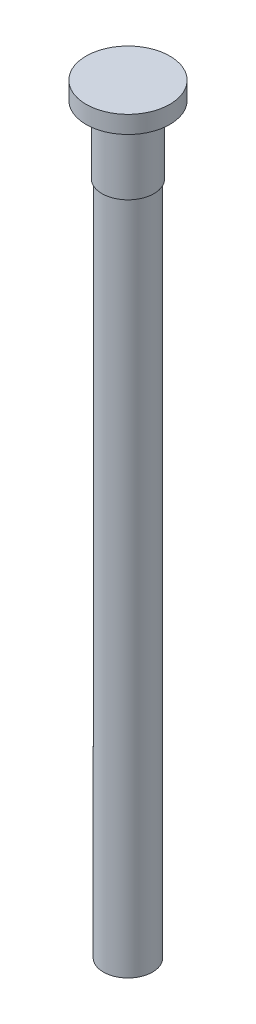
ISO-10303-21;
HEADER;
FILE_DESCRIPTION(('STEP AP214'),'2;1');
FILE_NAME('part.step','',(''),(''),'','','');
FILE_SCHEMA(('AUTOMOTIVE_DESIGN { 1 0 10303 214 1 1 1 1 }'));
ENDSEC;
DATA;
#1=APPLICATION_CONTEXT('core data for automotive mechanical design processes');
#2=APPLICATION_PROTOCOL_DEFINITION('international standard','automotive_design',2000,#1);
#3=PRODUCT_CONTEXT('',#1,'mechanical');
#4=PRODUCT('Part','Part','',(#3));
#5=PRODUCT_RELATED_PRODUCT_CATEGORY('part','',(#4));
#6=PRODUCT_DEFINITION_FORMATION('','',#4);
#7=PRODUCT_DEFINITION_CONTEXT('part definition',#1,'design');
#8=PRODUCT_DEFINITION('design','',#6,#7);
#9=PRODUCT_DEFINITION_SHAPE('','',#8);
#10=(LENGTH_UNIT() NAMED_UNIT(*) SI_UNIT(.MILLI.,.METRE.));
#11=(NAMED_UNIT(*) PLANE_ANGLE_UNIT() SI_UNIT($,.RADIAN.));
#12=(NAMED_UNIT(*) SI_UNIT($,.STERADIAN.) SOLID_ANGLE_UNIT());
#13=UNCERTAINTY_MEASURE_WITH_UNIT(LENGTH_MEASURE(1.E-05),#10,'distance_accuracy_value','');
#14=(GEOMETRIC_REPRESENTATION_CONTEXT(3) GLOBAL_UNCERTAINTY_ASSIGNED_CONTEXT((#13)) GLOBAL_UNIT_ASSIGNED_CONTEXT((#10,
#11,#12)) REPRESENTATION_CONTEXT('',''));
#15=CARTESIAN_POINT('',(0.,0.,0.));
#16=DIRECTION('',(0.,0.,1.));
#17=DIRECTION('',(1.,0.,0.));
#18=AXIS2_PLACEMENT_3D('',#15,#16,#17);
#19=CARTESIAN_POINT('',(0.,2.0955,0.));
#20=DIRECTION('',(0.,-1.,0.));
#21=DIRECTION('',(0.,0.,-1.));
#22=AXIS2_PLACEMENT_3D('',#19,#20,#21);
#23=CYLINDRICAL_SURFACE('',#22,5.0165);
#24=CARTESIAN_POINT('',(0.,2.0955,0.));
#25=DIRECTION('',(0.,1.,0.));
#26=DIRECTION('',(0.,0.,1.));
#27=AXIS2_PLACEMENT_3D('',#24,#25,#26);
#28=CIRCLE('',#27,5.0165);
#29=CARTESIAN_POINT('',(0.,2.0955,5.0165));
#30=VERTEX_POINT('',#29);
#31=EDGE_CURVE('E61',#30,#30,#28,.T.);
#32=ORIENTED_EDGE('',*,*,#31,.F.);
#33=EDGE_LOOP('',(#32));
#34=FACE_BOUND('',#33,.T.);
#35=CARTESIAN_POINT('',(0.,0.,0.));
#36=DIRECTION('',(0.,1.,0.));
#37=DIRECTION('',(0.,0.,1.));
#38=AXIS2_PLACEMENT_3D('',#35,#36,#37);
#39=CIRCLE('',#38,5.0165);
#40=CARTESIAN_POINT('',(0.,0.,5.0165));
#41=VERTEX_POINT('',#40);
#42=EDGE_CURVE('E64',#41,#41,#39,.T.);
#43=ORIENTED_EDGE('',*,*,#42,.T.);
#44=EDGE_LOOP('',(#43));
#45=FACE_BOUND('',#44,.T.);
#46=ADVANCED_FACE('F43',(#34,#45),#23,.T.);
#47=CARTESIAN_POINT('',(0.,2.0955,0.));
#48=DIRECTION('',(0.,1.,0.));
#49=DIRECTION('',(0.,0.,1.));
#50=AXIS2_PLACEMENT_3D('',#47,#48,#49);
#51=PLANE('',#50);
#52=ORIENTED_EDGE('',*,*,#31,.T.);
#53=EDGE_LOOP('',(#52));
#54=FACE_BOUND('',#53,.T.);
#55=ADVANCED_FACE('F89',(#54),#51,.T.);
#56=CARTESIAN_POINT('',(0.,0.,0.));
#57=DIRECTION('',(0.,1.,0.));
#58=DIRECTION('',(0.,0.,1.));
#59=AXIS2_PLACEMENT_3D('',#56,#57,#58);
#60=PLANE('',#59);
#61=CARTESIAN_POINT('',(0.,0.,0.));
#62=DIRECTION('',(0.,1.,0.));
#63=DIRECTION('',(0.,0.,1.));
#64=AXIS2_PLACEMENT_3D('',#61,#62,#63);
#65=CIRCLE('',#64,3.1115);
#66=CARTESIAN_POINT('',(0.,0.,3.1115));
#67=VERTEX_POINT('',#66);
#68=EDGE_CURVE('E51',#67,#67,#65,.F.);
#69=ORIENTED_EDGE('',*,*,#68,.F.);
#70=EDGE_LOOP('',(#69));
#71=FACE_BOUND('',#70,.T.);
#72=ORIENTED_EDGE('',*,*,#42,.F.);
#73=EDGE_LOOP('',(#72));
#74=FACE_BOUND('',#73,.T.);
#75=ADVANCED_FACE('F80',(#71,#74),#60,.F.);
#76=CARTESIAN_POINT('',(0.,-8.128,0.));
#77=DIRECTION('',(0.,1.,0.));
#78=DIRECTION('',(0.,0.,1.));
#79=AXIS2_PLACEMENT_3D('',#76,#77,#78);
#80=CYLINDRICAL_SURFACE('',#79,3.1115);
#81=CARTESIAN_POINT('',(0.,-8.128,0.));
#82=DIRECTION('',(0.,-1.,0.));
#83=DIRECTION('',(0.,0.,-1.));
#84=AXIS2_PLACEMENT_3D('',#81,#82,#83);
#85=CIRCLE('',#84,3.1115);
#86=CARTESIAN_POINT('',(0.,-8.128,-3.1115));
#87=VERTEX_POINT('',#86);
#88=EDGE_CURVE('E68',#87,#87,#85,.T.);
#89=ORIENTED_EDGE('',*,*,#88,.F.);
#90=EDGE_LOOP('',(#89));
#91=FACE_BOUND('',#90,.T.);
#92=ORIENTED_EDGE('',*,*,#68,.T.);
#93=EDGE_LOOP('',(#92));
#94=FACE_BOUND('',#93,.T.);
#95=ADVANCED_FACE('F78',(#91,#94),#80,.T.);
#96=CARTESIAN_POINT('',(0.,-8.128,0.));
#97=DIRECTION('',(0.,-1.,0.));
#98=DIRECTION('',(0.,0.,-1.));
#99=AXIS2_PLACEMENT_3D('',#96,#97,#98);
#100=PLANE('',#99);
#101=CARTESIAN_POINT('',(0.,-8.128,0.));
#102=DIRECTION('',(0.,-1.,0.));
#103=DIRECTION('',(0.,0.,-1.));
#104=AXIS2_PLACEMENT_3D('',#101,#102,#103);
#105=CIRCLE('',#104,2.9464);
#106=CARTESIAN_POINT('',(0.,-8.128,-2.9464));
#107=VERTEX_POINT('',#106);
#108=EDGE_CURVE('E10',#107,#107,#105,.F.);
#109=ORIENTED_EDGE('',*,*,#108,.T.);
#110=EDGE_LOOP('',(#109));
#111=FACE_BOUND('',#110,.T.);
#112=ORIENTED_EDGE('',*,*,#88,.T.);
#113=EDGE_LOOP('',(#112));
#114=FACE_BOUND('',#113,.T.);
#115=ADVANCED_FACE('F76',(#111,#114),#100,.T.);
#116=CARTESIAN_POINT('',(0.,-89.0143,0.));
#117=DIRECTION('',(0.,1.,0.));
#118=DIRECTION('',(0.,0.,1.));
#119=AXIS2_PLACEMENT_3D('',#116,#117,#118);
#120=PLANE('',#119);
#121=CARTESIAN_POINT('',(0.,-89.0143,0.));
#122=DIRECTION('',(0.,1.,0.));
#123=DIRECTION('',(0.,0.,1.));
#124=AXIS2_PLACEMENT_3D('',#121,#122,#123);
#125=CIRCLE('',#124,2.9464);
#126=CARTESIAN_POINT('',(0.,-89.0143,2.9464));
#127=VERTEX_POINT('',#126);
#128=EDGE_CURVE('E56',#127,#127,#125,.T.);
#129=ORIENTED_EDGE('',*,*,#128,.F.);
#130=EDGE_LOOP('',(#129));
#131=FACE_BOUND('',#130,.T.);
#132=ADVANCED_FACE('F86',(#131),#120,.F.);
#133=CARTESIAN_POINT('',(0.,-89.0143,0.));
#134=DIRECTION('',(0.,1.,0.));
#135=DIRECTION('',(0.,0.,1.));
#136=AXIS2_PLACEMENT_3D('',#133,#134,#135);
#137=CYLINDRICAL_SURFACE('',#136,2.9464);
#138=ORIENTED_EDGE('',*,*,#108,.F.);
#139=EDGE_LOOP('',(#138));
#140=FACE_BOUND('',#139,.T.);
#141=ORIENTED_EDGE('',*,*,#128,.T.);
#142=EDGE_LOOP('',(#141));
#143=FACE_BOUND('',#142,.T.);
#144=ADVANCED_FACE('F45',(#140,#143),#137,.T.);
#145=CLOSED_SHELL('',(#46,#55,#75,#95,#115,#132,#144));
#146=MANIFOLD_SOLID_BREP('B2',#145);
#147=ADVANCED_BREP_SHAPE_REPRESENTATION('',(#18,#146),#14);
#148=SHAPE_DEFINITION_REPRESENTATION(#9,#147);
ENDSEC;
END-ISO-10303-21;
